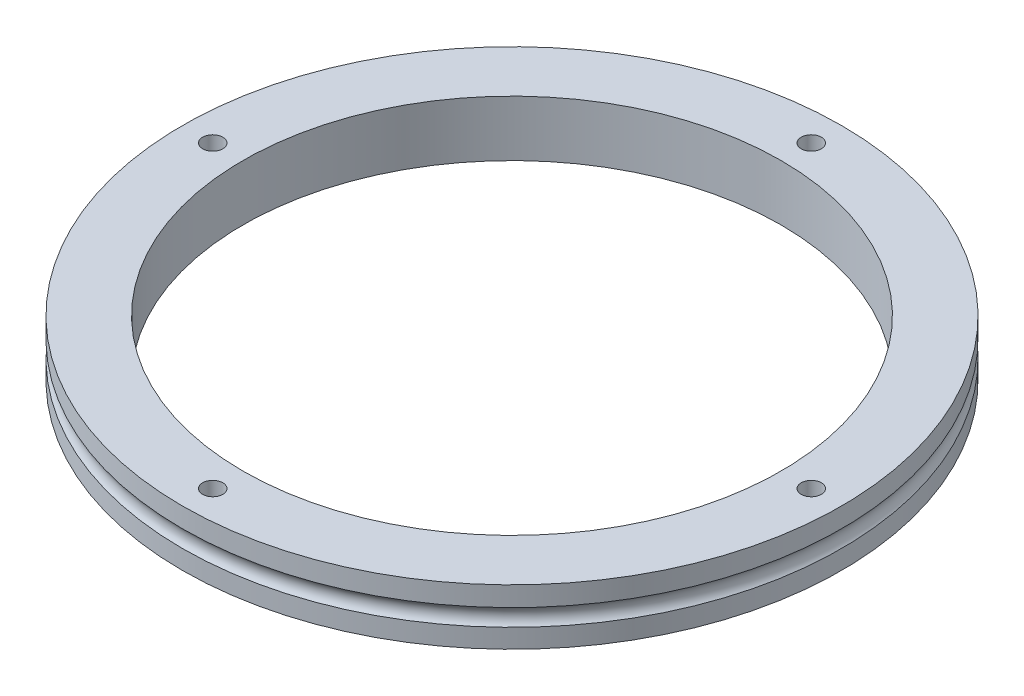
ISO-10303-21;
HEADER;
FILE_DESCRIPTION(('STEP AP214'),'2;1');
FILE_NAME('part.step','',(''),(''),'','','');
FILE_SCHEMA(('AUTOMOTIVE_DESIGN { 1 0 10303 214 1 1 1 1 }'));
ENDSEC;
DATA;
#1=APPLICATION_CONTEXT('core data for automotive mechanical design processes');
#2=APPLICATION_PROTOCOL_DEFINITION('international standard','automotive_design',2000,#1);
#3=PRODUCT_CONTEXT('',#1,'mechanical');
#4=PRODUCT('Part','Part','',(#3));
#5=PRODUCT_RELATED_PRODUCT_CATEGORY('part','',(#4));
#6=PRODUCT_DEFINITION_FORMATION('','',#4);
#7=PRODUCT_DEFINITION_CONTEXT('part definition',#1,'design');
#8=PRODUCT_DEFINITION('design','',#6,#7);
#9=PRODUCT_DEFINITION_SHAPE('','',#8);
#10=(LENGTH_UNIT() NAMED_UNIT(*) SI_UNIT(.MILLI.,.METRE.));
#11=(NAMED_UNIT(*) PLANE_ANGLE_UNIT() SI_UNIT($,.RADIAN.));
#12=(NAMED_UNIT(*) SI_UNIT($,.STERADIAN.) SOLID_ANGLE_UNIT());
#13=UNCERTAINTY_MEASURE_WITH_UNIT(LENGTH_MEASURE(1.E-05),#10,'distance_accuracy_value','');
#14=(GEOMETRIC_REPRESENTATION_CONTEXT(3) GLOBAL_UNCERTAINTY_ASSIGNED_CONTEXT((#13)) GLOBAL_UNIT_ASSIGNED_CONTEXT((#10,
#11,#12)) REPRESENTATION_CONTEXT('',''));
#15=CARTESIAN_POINT('',(0.,0.,0.));
#16=DIRECTION('',(0.,0.,1.));
#17=DIRECTION('',(1.,0.,0.));
#18=AXIS2_PLACEMENT_3D('',#15,#16,#17);
#19=CARTESIAN_POINT('',(2.24783033579817,16.788080184314,0.));
#20=DIRECTION('',(0.,1.,0.));
#21=DIRECTION('',(0.,0.,1.));
#22=AXIS2_PLACEMENT_3D('',#19,#20,#21);
#23=CYLINDRICAL_SURFACE('',#22,49.);
#24=CARTESIAN_POINT('',(2.24783033579817,13.8566495046544,0.));
#25=DIRECTION('',(0.,1.,0.));
#26=DIRECTION('',(0.,0.,1.));
#27=AXIS2_PLACEMENT_3D('',#24,#25,#26);
#28=CIRCLE('',#27,49.);
#29=CARTESIAN_POINT('',(2.24783033579817,13.8566495046544,49.));
#30=VERTEX_POINT('',#29);
#31=EDGE_CURVE('E10',#30,#30,#28,.T.);
#32=ORIENTED_EDGE('',*,*,#31,.T.);
#33=EDGE_LOOP('',(#32));
#34=FACE_BOUND('',#33,.T.);
#35=CARTESIAN_POINT('',(2.24783033579817,16.788080184314,0.));
#36=DIRECTION('',(0.,1.,0.));
#37=DIRECTION('',(0.,0.,1.));
#38=AXIS2_PLACEMENT_3D('',#35,#36,#37);
#39=CIRCLE('',#38,49.);
#40=CARTESIAN_POINT('',(2.24783033579817,16.788080184314,49.));
#41=VERTEX_POINT('',#40);
#42=EDGE_CURVE('E54',#41,#41,#39,.T.);
#43=ORIENTED_EDGE('',*,*,#42,.F.);
#44=EDGE_LOOP('',(#43));
#45=FACE_BOUND('',#44,.T.);
#46=ADVANCED_FACE('F40',(#34,#45),#23,.T.);
#47=CARTESIAN_POINT('',(2.24783033579817,12.588080184314,0.));
#48=DIRECTION('',(0.,1.,0.));
#49=DIRECTION('',(0.,0.,1.));
#50=AXIS2_PLACEMENT_3D('',#47,#48,#49);
#51=TOROIDAL_SURFACE('',#50,50.3592681205089,1.85926812050893);
#52=CARTESIAN_POINT('',(2.24783033579817,11.3195108639736,0.));
#53=DIRECTION('',(0.,1.,0.));
#54=DIRECTION('',(0.,0.,1.));
#55=AXIS2_PLACEMENT_3D('',#52,#53,#54);
#56=CIRCLE('',#55,49.);
#57=CARTESIAN_POINT('',(2.24783033579817,11.3195108639736,49.));
#58=VERTEX_POINT('',#57);
#59=EDGE_CURVE('E46',#58,#58,#56,.T.);
#60=ORIENTED_EDGE('',*,*,#59,.T.);
#61=EDGE_LOOP('',(#60));
#62=FACE_BOUND('',#61,.T.);
#63=ORIENTED_EDGE('',*,*,#31,.F.);
#64=EDGE_LOOP('',(#63));
#65=FACE_BOUND('',#64,.T.);
#66=ADVANCED_FACE('F109',(#62,#65),#51,.F.);
#67=CARTESIAN_POINT('',(2.24783033579817,16.788080184314,0.));
#68=DIRECTION('',(0.,1.,0.));
#69=DIRECTION('',(0.,0.,1.));
#70=AXIS2_PLACEMENT_3D('',#67,#68,#69);
#71=CYLINDRICAL_SURFACE('',#70,49.);
#72=CARTESIAN_POINT('',(2.24783033579817,8.48808018431401,0.));
#73=DIRECTION('',(0.,1.,0.));
#74=DIRECTION('',(0.,0.,1.));
#75=AXIS2_PLACEMENT_3D('',#72,#73,#74);
#76=CIRCLE('',#75,49.);
#77=CARTESIAN_POINT('',(2.24783033579817,8.48808018431401,49.));
#78=VERTEX_POINT('',#77);
#79=EDGE_CURVE('E50',#78,#78,#76,.T.);
#80=ORIENTED_EDGE('',*,*,#79,.T.);
#81=EDGE_LOOP('',(#80));
#82=FACE_BOUND('',#81,.T.);
#83=ORIENTED_EDGE('',*,*,#59,.F.);
#84=EDGE_LOOP('',(#83));
#85=FACE_BOUND('',#84,.T.);
#86=ADVANCED_FACE('F113',(#82,#85),#71,.T.);
#87=CARTESIAN_POINT('',(-46.7521696642018,8.48808018431401,0.));
#88=DIRECTION('',(0.,-1.,0.));
#89=DIRECTION('',(0.,0.,-1.));
#90=AXIS2_PLACEMENT_3D('',#87,#88,#89);
#91=PLANE('',#90);
#92=CARTESIAN_POINT('',(2.24783033579817,8.48808018431401,-44.5));
#93=DIRECTION('',(0.,-1.,0.));
#94=DIRECTION('',(0.,0.,-1.));
#95=AXIS2_PLACEMENT_3D('',#92,#93,#94);
#96=CIRCLE('',#95,1.5);
#97=CARTESIAN_POINT('',(2.24783033579817,8.48808018431401,-46.));
#98=VERTEX_POINT('',#97);
#99=EDGE_CURVE('E65',#98,#98,#96,.T.);
#100=ORIENTED_EDGE('',*,*,#99,.F.);
#101=EDGE_LOOP('',(#100));
#102=FACE_BOUND('',#101,.T.);
#103=CARTESIAN_POINT('',(46.7478303357981,8.48808018431401,0.));
#104=DIRECTION('',(0.,-1.,0.));
#105=DIRECTION('',(0.,0.,-1.));
#106=AXIS2_PLACEMENT_3D('',#103,#104,#105);
#107=CIRCLE('',#106,1.5);
#108=CARTESIAN_POINT('',(46.7478303357981,8.48808018431401,-1.5));
#109=VERTEX_POINT('',#108);
#110=EDGE_CURVE('E68',#109,#109,#107,.T.);
#111=ORIENTED_EDGE('',*,*,#110,.F.);
#112=EDGE_LOOP('',(#111));
#113=FACE_BOUND('',#112,.T.);
#114=CARTESIAN_POINT('',(2.24783033579817,8.48808018431401,44.5));
#115=DIRECTION('',(0.,-1.,0.));
#116=DIRECTION('',(0.,0.,-1.));
#117=AXIS2_PLACEMENT_3D('',#114,#115,#116);
#118=CIRCLE('',#117,1.5);
#119=CARTESIAN_POINT('',(2.24783033579817,8.48808018431401,43.));
#120=VERTEX_POINT('',#119);
#121=EDGE_CURVE('E71',#120,#120,#118,.T.);
#122=ORIENTED_EDGE('',*,*,#121,.F.);
#123=EDGE_LOOP('',(#122));
#124=FACE_BOUND('',#123,.T.);
#125=CARTESIAN_POINT('',(-42.2521696642018,8.48808018431401,0.));
#126=DIRECTION('',(0.,-1.,0.));
#127=DIRECTION('',(0.,0.,-1.));
#128=AXIS2_PLACEMENT_3D('',#125,#126,#127);
#129=CIRCLE('',#128,1.5);
#130=CARTESIAN_POINT('',(-42.2521696642018,8.48808018431401,-1.5));
#131=VERTEX_POINT('',#130);
#132=EDGE_CURVE('E74',#131,#131,#129,.T.);
#133=ORIENTED_EDGE('',*,*,#132,.F.);
#134=EDGE_LOOP('',(#133));
#135=FACE_BOUND('',#134,.T.);
#136=CARTESIAN_POINT('',(2.24783033579817,8.48808018431401,0.));
#137=DIRECTION('',(0.,-1.,0.));
#138=DIRECTION('',(0.,0.,-1.));
#139=AXIS2_PLACEMENT_3D('',#136,#137,#138);
#140=CIRCLE('',#139,40.);
#141=CARTESIAN_POINT('',(2.24783033579817,8.48808018431401,-40.));
#142=VERTEX_POINT('',#141);
#143=EDGE_CURVE('E59',#142,#142,#140,.F.);
#144=ORIENTED_EDGE('',*,*,#143,.T.);
#145=EDGE_LOOP('',(#144));
#146=FACE_BOUND('',#145,.T.);
#147=ORIENTED_EDGE('',*,*,#79,.F.);
#148=EDGE_LOOP('',(#147));
#149=FACE_BOUND('',#148,.T.);
#150=ADVANCED_FACE('F96',(#102,#113,#124,#135,#146,#149),#91,.T.);
#151=CARTESIAN_POINT('',(-46.7521696642018,16.788080184314,0.));
#152=DIRECTION('',(0.,1.,0.));
#153=DIRECTION('',(0.,0.,1.));
#154=AXIS2_PLACEMENT_3D('',#151,#152,#153);
#155=PLANE('',#154);
#156=CARTESIAN_POINT('',(2.24783033579817,16.788080184314,-44.5));
#157=DIRECTION('',(0.,1.,0.));
#158=DIRECTION('',(0.,0.,1.));
#159=AXIS2_PLACEMENT_3D('',#156,#157,#158);
#160=CIRCLE('',#159,1.5);
#161=CARTESIAN_POINT('',(2.24783033579817,16.788080184314,-43.));
#162=VERTEX_POINT('',#161);
#163=EDGE_CURVE('E77',#162,#162,#160,.T.);
#164=ORIENTED_EDGE('',*,*,#163,.F.);
#165=EDGE_LOOP('',(#164));
#166=FACE_BOUND('',#165,.T.);
#167=CARTESIAN_POINT('',(46.7478303357981,16.788080184314,0.));
#168=DIRECTION('',(0.,1.,0.));
#169=DIRECTION('',(0.,0.,1.));
#170=AXIS2_PLACEMENT_3D('',#167,#168,#169);
#171=CIRCLE('',#170,1.5);
#172=CARTESIAN_POINT('',(46.7478303357981,16.788080184314,1.5));
#173=VERTEX_POINT('',#172);
#174=EDGE_CURVE('E84',#173,#173,#171,.T.);
#175=ORIENTED_EDGE('',*,*,#174,.F.);
#176=EDGE_LOOP('',(#175));
#177=FACE_BOUND('',#176,.T.);
#178=CARTESIAN_POINT('',(2.24783033579817,16.788080184314,44.5));
#179=DIRECTION('',(0.,1.,0.));
#180=DIRECTION('',(0.,0.,1.));
#181=AXIS2_PLACEMENT_3D('',#178,#179,#180);
#182=CIRCLE('',#181,1.5);
#183=CARTESIAN_POINT('',(2.24783033579817,16.788080184314,46.));
#184=VERTEX_POINT('',#183);
#185=EDGE_CURVE('E81',#184,#184,#182,.T.);
#186=ORIENTED_EDGE('',*,*,#185,.F.);
#187=EDGE_LOOP('',(#186));
#188=FACE_BOUND('',#187,.T.);
#189=CARTESIAN_POINT('',(-42.2521696642018,16.788080184314,0.));
#190=DIRECTION('',(0.,1.,0.));
#191=DIRECTION('',(0.,0.,1.));
#192=AXIS2_PLACEMENT_3D('',#189,#190,#191);
#193=CIRCLE('',#192,1.5);
#194=CARTESIAN_POINT('',(-42.2521696642018,16.788080184314,1.5));
#195=VERTEX_POINT('',#194);
#196=EDGE_CURVE('E78',#195,#195,#193,.T.);
#197=ORIENTED_EDGE('',*,*,#196,.F.);
#198=EDGE_LOOP('',(#197));
#199=FACE_BOUND('',#198,.T.);
#200=CARTESIAN_POINT('',(2.24783033579817,16.788080184314,0.));
#201=DIRECTION('',(0.,1.,0.));
#202=DIRECTION('',(0.,0.,1.));
#203=AXIS2_PLACEMENT_3D('',#200,#201,#202);
#204=CIRCLE('',#203,40.);
#205=CARTESIAN_POINT('',(2.24783033579817,16.788080184314,39.9999999999999));
#206=VERTEX_POINT('',#205);
#207=EDGE_CURVE('E62',#206,#206,#204,.T.);
#208=ORIENTED_EDGE('',*,*,#207,.F.);
#209=EDGE_LOOP('',(#208));
#210=FACE_BOUND('',#209,.T.);
#211=ORIENTED_EDGE('',*,*,#42,.T.);
#212=EDGE_LOOP('',(#211));
#213=FACE_BOUND('',#212,.T.);
#214=ADVANCED_FACE('F92',(#166,#177,#188,#199,#210,#213),#155,.T.);
#215=CARTESIAN_POINT('',(2.24783033579817,16.788080184314,0.));
#216=DIRECTION('',(0.,-1.,0.));
#217=DIRECTION('',(0.,0.,-1.));
#218=AXIS2_PLACEMENT_3D('',#215,#216,#217);
#219=CYLINDRICAL_SURFACE('',#218,40.);
#220=ORIENTED_EDGE('',*,*,#143,.F.);
#221=EDGE_LOOP('',(#220));
#222=FACE_BOUND('',#221,.T.);
#223=ORIENTED_EDGE('',*,*,#207,.T.);
#224=EDGE_LOOP('',(#223));
#225=FACE_BOUND('',#224,.T.);
#226=ADVANCED_FACE('F95',(#222,#225),#219,.F.);
#227=CARTESIAN_POINT('',(-42.2521696642018,6.78808018431401,0.));
#228=DIRECTION('',(0.,1.,0.));
#229=DIRECTION('',(0.,0.,1.));
#230=AXIS2_PLACEMENT_3D('',#227,#228,#229);
#231=CYLINDRICAL_SURFACE('',#230,1.5);
#232=ORIENTED_EDGE('',*,*,#132,.T.);
#233=EDGE_LOOP('',(#232));
#234=FACE_BOUND('',#233,.T.);
#235=ORIENTED_EDGE('',*,*,#196,.T.);
#236=EDGE_LOOP('',(#235));
#237=FACE_BOUND('',#236,.T.);
#238=ADVANCED_FACE('F126',(#234,#237),#231,.F.);
#239=CARTESIAN_POINT('',(2.24783033579817,6.78808018431401,44.5));
#240=DIRECTION('',(0.,1.,0.));
#241=DIRECTION('',(0.,0.,1.));
#242=AXIS2_PLACEMENT_3D('',#239,#240,#241);
#243=CYLINDRICAL_SURFACE('',#242,1.5);
#244=ORIENTED_EDGE('',*,*,#121,.T.);
#245=EDGE_LOOP('',(#244));
#246=FACE_BOUND('',#245,.T.);
#247=ORIENTED_EDGE('',*,*,#185,.T.);
#248=EDGE_LOOP('',(#247));
#249=FACE_BOUND('',#248,.T.);
#250=ADVANCED_FACE('F130',(#246,#249),#243,.F.);
#251=CARTESIAN_POINT('',(46.7478303357981,6.78808018431401,0.));
#252=DIRECTION('',(0.,1.,0.));
#253=DIRECTION('',(0.,0.,1.));
#254=AXIS2_PLACEMENT_3D('',#251,#252,#253);
#255=CYLINDRICAL_SURFACE('',#254,1.5);
#256=ORIENTED_EDGE('',*,*,#110,.T.);
#257=EDGE_LOOP('',(#256));
#258=FACE_BOUND('',#257,.T.);
#259=ORIENTED_EDGE('',*,*,#174,.T.);
#260=EDGE_LOOP('',(#259));
#261=FACE_BOUND('',#260,.T.);
#262=ADVANCED_FACE('F134',(#258,#261),#255,.F.);
#263=CARTESIAN_POINT('',(2.24783033579817,6.78808018431401,-44.5));
#264=DIRECTION('',(0.,1.,0.));
#265=DIRECTION('',(0.,0.,1.));
#266=AXIS2_PLACEMENT_3D('',#263,#264,#265);
#267=CYLINDRICAL_SURFACE('',#266,1.5);
#268=ORIENTED_EDGE('',*,*,#99,.T.);
#269=EDGE_LOOP('',(#268));
#270=FACE_BOUND('',#269,.T.);
#271=ORIENTED_EDGE('',*,*,#163,.T.);
#272=EDGE_LOOP('',(#271));
#273=FACE_BOUND('',#272,.T.);
#274=ADVANCED_FACE('F90',(#270,#273),#267,.F.);
#275=CLOSED_SHELL('',(#46,#66,#86,#150,#214,#226,#238,#250,#262,#274));
#276=MANIFOLD_SOLID_BREP('B2',#275);
#277=ADVANCED_BREP_SHAPE_REPRESENTATION('',(#18,#276),#14);
#278=SHAPE_DEFINITION_REPRESENTATION(#9,#277);
ENDSEC;
END-ISO-10303-21;
